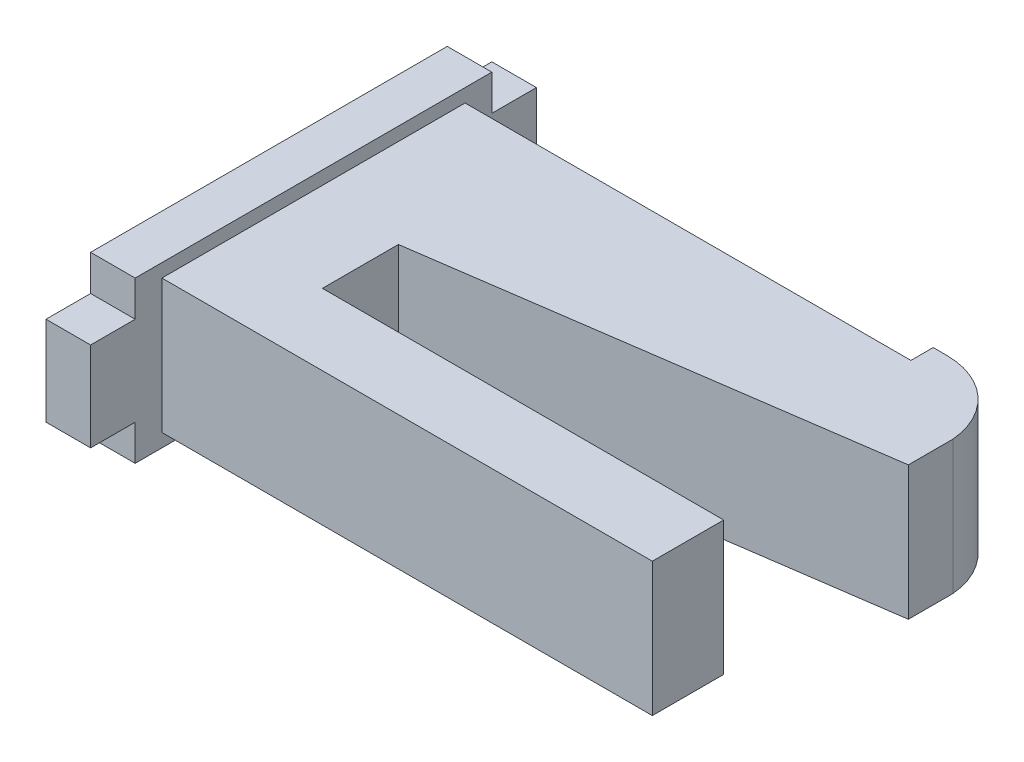
ISO-10303-21;
HEADER;
FILE_DESCRIPTION(('STEP AP214'),'2;1');
FILE_NAME('part.step','',(''),(''),'','','');
FILE_SCHEMA(('AUTOMOTIVE_DESIGN { 1 0 10303 214 1 1 1 1 }'));
ENDSEC;
DATA;
#1=APPLICATION_CONTEXT('core data for automotive mechanical design processes');
#2=APPLICATION_PROTOCOL_DEFINITION('international standard','automotive_design',2000,#1);
#3=PRODUCT_CONTEXT('',#1,'mechanical');
#4=PRODUCT('Part','Part','',(#3));
#5=PRODUCT_RELATED_PRODUCT_CATEGORY('part','',(#4));
#6=PRODUCT_DEFINITION_FORMATION('','',#4);
#7=PRODUCT_DEFINITION_CONTEXT('part definition',#1,'design');
#8=PRODUCT_DEFINITION('design','',#6,#7);
#9=PRODUCT_DEFINITION_SHAPE('','',#8);
#10=(LENGTH_UNIT() NAMED_UNIT(*) SI_UNIT(.MILLI.,.METRE.));
#11=(NAMED_UNIT(*) PLANE_ANGLE_UNIT() SI_UNIT($,.RADIAN.));
#12=(NAMED_UNIT(*) SI_UNIT($,.STERADIAN.) SOLID_ANGLE_UNIT());
#13=UNCERTAINTY_MEASURE_WITH_UNIT(LENGTH_MEASURE(1.E-05),#10,'distance_accuracy_value','');
#14=(GEOMETRIC_REPRESENTATION_CONTEXT(3) GLOBAL_UNCERTAINTY_ASSIGNED_CONTEXT((#13)) GLOBAL_UNIT_ASSIGNED_CONTEXT((#10,
#11,#12)) REPRESENTATION_CONTEXT('',''));
#15=CARTESIAN_POINT('',(0.,0.,0.));
#16=DIRECTION('',(0.,0.,1.));
#17=DIRECTION('',(1.,0.,0.));
#18=AXIS2_PLACEMENT_3D('',#15,#16,#17);
#19=CARTESIAN_POINT('',(0.,15.,-40.));
#20=DIRECTION('',(0.,0.,1.));
#21=DIRECTION('',(1.,0.,0.));
#22=AXIS2_PLACEMENT_3D('',#19,#20,#21);
#23=PLANE('',#22);
#24=DIRECTION('',(0.,-1.,0.));
#25=VECTOR('',#24,1.);
#26=CARTESIAN_POINT('',(0.,15.,-40.));
#27=LINE('',#26,#25);
#28=CARTESIAN_POINT('',(0.,2.5,-40.));
#29=VERTEX_POINT('',#28);
#30=CARTESIAN_POINT('',(0.,-1.5,-40.));
#31=VERTEX_POINT('',#30);
#32=EDGE_CURVE('E336',#29,#31,#27,.T.);
#33=ORIENTED_EDGE('',*,*,#32,.F.);
#34=DIRECTION('',(1.,0.,0.));
#35=VECTOR('',#34,1.);
#36=CARTESIAN_POINT('',(0.,2.5,-40.));
#37=LINE('',#36,#35);
#38=CARTESIAN_POINT('',(5.,2.5,-40.));
#39=VERTEX_POINT('',#38);
#40=EDGE_CURVE('E222',#29,#39,#37,.T.);
#41=ORIENTED_EDGE('',*,*,#40,.T.);
#42=DIRECTION('',(0.,-1.,0.));
#43=VECTOR('',#42,1.);
#44=CARTESIAN_POINT('',(5.,15.,-40.));
#45=LINE('',#44,#43);
#46=CARTESIAN_POINT('',(5.,-1.5,-40.));
#47=VERTEX_POINT('',#46);
#48=EDGE_CURVE('E201',#39,#47,#45,.T.);
#49=ORIENTED_EDGE('',*,*,#48,.T.);
#50=DIRECTION('',(1.,0.,0.));
#51=VECTOR('',#50,1.);
#52=CARTESIAN_POINT('',(5.,-1.5,-40.));
#53=LINE('',#52,#51);
#54=EDGE_CURVE('E279',#31,#47,#53,.T.);
#55=ORIENTED_EDGE('',*,*,#54,.F.);
#56=EDGE_LOOP('',(#33,#41,#49,#55));
#57=FACE_BOUND('',#56,.T.);
#58=ADVANCED_FACE('F39',(#57),#23,.F.);
#59=CARTESIAN_POINT('',(5.,15.,0.));
#60=DIRECTION('',(0.,0.,-1.));
#61=DIRECTION('',(-1.,0.,0.));
#62=AXIS2_PLACEMENT_3D('',#59,#60,#61);
#63=PLANE('',#62);
#64=DIRECTION('',(0.,-1.,0.));
#65=VECTOR('',#64,1.);
#66=CARTESIAN_POINT('',(5.,15.,0.));
#67=LINE('',#66,#65);
#68=CARTESIAN_POINT('',(5.,2.5,0.));
#69=VERTEX_POINT('',#68);
#70=CARTESIAN_POINT('',(5.,-1.5,0.));
#71=VERTEX_POINT('',#70);
#72=EDGE_CURVE('E370',#69,#71,#67,.T.);
#73=ORIENTED_EDGE('',*,*,#72,.F.);
#74=DIRECTION('',(-1.,0.,0.));
#75=VECTOR('',#74,1.);
#76=CARTESIAN_POINT('',(5.,2.5,0.));
#77=LINE('',#76,#75);
#78=CARTESIAN_POINT('',(0.,2.5,0.));
#79=VERTEX_POINT('',#78);
#80=EDGE_CURVE('E233',#69,#79,#77,.T.);
#81=ORIENTED_EDGE('',*,*,#80,.T.);
#82=DIRECTION('',(0.,-1.,0.));
#83=VECTOR('',#82,1.);
#84=CARTESIAN_POINT('',(0.,15.,0.));
#85=LINE('',#84,#83);
#86=CARTESIAN_POINT('',(0.,-1.5,0.));
#87=VERTEX_POINT('',#86);
#88=EDGE_CURVE('E316',#79,#87,#85,.T.);
#89=ORIENTED_EDGE('',*,*,#88,.T.);
#90=DIRECTION('',(-1.,0.,0.));
#91=VECTOR('',#90,1.);
#92=CARTESIAN_POINT('',(0.,-1.5,0.));
#93=LINE('',#92,#91);
#94=EDGE_CURVE('E281',#71,#87,#93,.T.);
#95=ORIENTED_EDGE('',*,*,#94,.F.);
#96=EDGE_LOOP('',(#73,#81,#89,#95));
#97=FACE_BOUND('',#96,.T.);
#98=ADVANCED_FACE('F399',(#97),#63,.F.);
#99=CARTESIAN_POINT('',(56.5,15.,-30.9674770892384));
#100=DIRECTION('',(0.,-1.,0.));
#101=DIRECTION('',(0.,0.,-1.));
#102=AXIS2_PLACEMENT_3D('',#99,#100,#101);
#103=PLANE('',#102);
#104=DIRECTION('',(0.,0.,-1.));
#105=VECTOR('',#104,1.);
#106=CARTESIAN_POINT('',(5.,15.,-40.));
#107=LINE('',#106,#105);
#108=CARTESIAN_POINT('',(5.,15.,-3.));
#109=VERTEX_POINT('',#108);
#110=CARTESIAN_POINT('',(5.,15.,-37.));
#111=VERTEX_POINT('',#110);
#112=EDGE_CURVE('E48',#109,#111,#107,.T.);
#113=ORIENTED_EDGE('',*,*,#112,.F.);
#114=DIRECTION('',(1.,0.,0.));
#115=VECTOR('',#114,1.);
#116=CARTESIAN_POINT('',(15.,15.,-3.));
#117=LINE('',#116,#115);
#118=CARTESIAN_POINT('',(60.,15.,-3.00000000000001));
#119=VERTEX_POINT('',#118);
#120=EDGE_CURVE('E305',#109,#119,#117,.T.);
#121=ORIENTED_EDGE('',*,*,#120,.T.);
#122=DIRECTION('',(0.,0.,-1.));
#123=VECTOR('',#122,1.);
#124=CARTESIAN_POINT('',(60.,15.,-3.00000000000001));
#125=LINE('',#124,#123);
#126=CARTESIAN_POINT('',(60.,15.,-11.));
#127=VERTEX_POINT('',#126);
#128=EDGE_CURVE('E264',#119,#127,#125,.T.);
#129=ORIENTED_EDGE('',*,*,#128,.T.);
#130=DIRECTION('',(-1.,0.,0.));
#131=VECTOR('',#130,1.);
#132=CARTESIAN_POINT('',(60.,15.,-11.));
#133=LINE('',#132,#131);
#134=CARTESIAN_POINT('',(15.,15.,-11.));
#135=VERTEX_POINT('',#134);
#136=EDGE_CURVE('E267',#127,#135,#133,.T.);
#137=ORIENTED_EDGE('',*,*,#136,.T.);
#138=DIRECTION('',(0.,0.,-1.));
#139=VECTOR('',#138,1.);
#140=CARTESIAN_POINT('',(15.,15.,-19.5182848298487));
#141=LINE('',#140,#139);
#142=CARTESIAN_POINT('',(15.,15.,-19.5182848298487));
#143=VERTEX_POINT('',#142);
#144=EDGE_CURVE('E302',#135,#143,#141,.T.);
#145=ORIENTED_EDGE('',*,*,#144,.T.);
#146=DIRECTION('',(0.989808738963641,0.,-0.142403161029544));
#147=VECTOR('',#146,1.);
#148=CARTESIAN_POINT('',(65.,15.,-26.7117533972531));
#149=LINE('',#148,#147);
#150=CARTESIAN_POINT('',(65.,15.,-26.7117533972531));
#151=VERTEX_POINT('',#150);
#152=EDGE_CURVE('E310',#143,#151,#149,.T.);
#153=ORIENTED_EDGE('',*,*,#152,.T.);
#154=DIRECTION('',(0.,0.,-1.));
#155=VECTOR('',#154,1.);
#156=CARTESIAN_POINT('',(65.,15.,-31.7117533972531));
#157=LINE('',#156,#155);
#158=CARTESIAN_POINT('',(65.,15.,-31.7117533972531));
#159=VERTEX_POINT('',#158);
#160=EDGE_CURVE('E307',#151,#159,#157,.T.);
#161=ORIENTED_EDGE('',*,*,#160,.T.);
#162=CARTESIAN_POINT('',(56.5,15.,-30.9674770892384));
#163=DIRECTION('',(0.,1.,0.));
#164=DIRECTION('',(0.,0.,-1.));
#165=AXIS2_PLACEMENT_3D('',#162,#163,#164);
#166=CIRCLE('',#165,8.53252291076164);
#167=CARTESIAN_POINT('',(56.5,15.,-39.5));
#168=VERTEX_POINT('',#167);
#169=EDGE_CURVE('E311',#159,#168,#166,.T.);
#170=ORIENTED_EDGE('',*,*,#169,.T.);
#171=DIRECTION('',(-1.,0.,0.));
#172=VECTOR('',#171,1.);
#173=CARTESIAN_POINT('',(55.,15.,-39.5));
#174=LINE('',#173,#172);
#175=CARTESIAN_POINT('',(55.,15.,-39.5));
#176=VERTEX_POINT('',#175);
#177=EDGE_CURVE('E312',#168,#176,#174,.T.);
#178=ORIENTED_EDGE('',*,*,#177,.T.);
#179=DIRECTION('',(0.,0.,1.));
#180=VECTOR('',#179,1.);
#181=CARTESIAN_POINT('',(55.,15.,-37.));
#182=LINE('',#181,#180);
#183=CARTESIAN_POINT('',(55.,15.,-37.));
#184=VERTEX_POINT('',#183);
#185=EDGE_CURVE('E314',#176,#184,#182,.T.);
#186=ORIENTED_EDGE('',*,*,#185,.T.);
#187=DIRECTION('',(-1.,0.,0.));
#188=VECTOR('',#187,1.);
#189=CARTESIAN_POINT('',(5.,15.,-37.));
#190=LINE('',#189,#188);
#191=EDGE_CURVE('E320',#184,#111,#190,.T.);
#192=ORIENTED_EDGE('',*,*,#191,.T.);
#193=EDGE_LOOP('',(#113,#121,#129,#137,#145,#153,#161,#170,#178,#186,#192));
#194=FACE_BOUND('',#193,.T.);
#195=ADVANCED_FACE('F409',(#194),#103,.F.);
#196=CARTESIAN_POINT('',(0.,16.5,0.));
#197=VERTEX_POINT('',#196);
#198=CARTESIAN_POINT('',(0.,12.5,0.));
#199=VERTEX_POINT('',#198);
#200=EDGE_CURVE('E334',#197,#199,#85,.T.);
#201=ORIENTED_EDGE('',*,*,#200,.T.);
#202=DIRECTION('',(1.,0.,0.));
#203=VECTOR('',#202,1.);
#204=CARTESIAN_POINT('',(0.,12.5,0.));
#205=LINE('',#204,#203);
#206=CARTESIAN_POINT('',(5.,12.5,0.));
#207=VERTEX_POINT('',#206);
#208=EDGE_CURVE('E238',#199,#207,#205,.T.);
#209=ORIENTED_EDGE('',*,*,#208,.T.);
#210=CARTESIAN_POINT('',(5.,16.5,0.));
#211=VERTEX_POINT('',#210);
#212=EDGE_CURVE('E43',#211,#207,#67,.T.);
#213=ORIENTED_EDGE('',*,*,#212,.F.);
#214=DIRECTION('',(1.,0.,0.));
#215=VECTOR('',#214,1.);
#216=CARTESIAN_POINT('',(5.,16.5,0.));
#217=LINE('',#216,#215);
#218=EDGE_CURVE('E291',#197,#211,#217,.T.);
#219=ORIENTED_EDGE('',*,*,#218,.F.);
#220=EDGE_LOOP('',(#201,#209,#213,#219));
#221=FACE_BOUND('',#220,.T.);
#222=ADVANCED_FACE('F41',(#221),#63,.F.);
#223=CARTESIAN_POINT('',(15.,15.,-3.));
#224=DIRECTION('',(0.,0.,-1.));
#225=DIRECTION('',(-1.,0.,0.));
#226=AXIS2_PLACEMENT_3D('',#223,#224,#225);
#227=PLANE('',#226);
#228=DIRECTION('',(1.,0.,0.));
#229=VECTOR('',#228,1.);
#230=CARTESIAN_POINT('',(15.,0.,-3.));
#231=LINE('',#230,#229);
#232=CARTESIAN_POINT('',(5.,0.,-3.));
#233=VERTEX_POINT('',#232);
#234=CARTESIAN_POINT('',(60.,0.,-3.00000000000001));
#235=VERTEX_POINT('',#234);
#236=EDGE_CURVE('E299',#233,#235,#231,.T.);
#237=ORIENTED_EDGE('',*,*,#236,.T.);
#238=DIRECTION('',(0.,1.,0.));
#239=VECTOR('',#238,1.);
#240=CARTESIAN_POINT('',(60.,0.,-3.00000000000001));
#241=LINE('',#240,#239);
#242=EDGE_CURVE('E258',#235,#119,#241,.T.);
#243=ORIENTED_EDGE('',*,*,#242,.T.);
#244=ORIENTED_EDGE('',*,*,#120,.F.);
#245=DIRECTION('',(0.,-1.,0.));
#246=VECTOR('',#245,1.);
#247=CARTESIAN_POINT('',(5.,15.,-3.));
#248=LINE('',#247,#246);
#249=EDGE_CURVE('E362',#109,#233,#248,.T.);
#250=ORIENTED_EDGE('',*,*,#249,.T.);
#251=EDGE_LOOP('',(#237,#243,#244,#250));
#252=FACE_BOUND('',#251,.T.);
#253=ADVANCED_FACE('F624',(#252),#227,.F.);
#254=CARTESIAN_POINT('',(15.,15.,-19.5182848298487));
#255=DIRECTION('',(-1.,0.,0.));
#256=DIRECTION('',(0.,0.,1.));
#257=AXIS2_PLACEMENT_3D('',#254,#255,#256);
#258=PLANE('',#257);
#259=ORIENTED_EDGE('',*,*,#144,.F.);
#260=DIRECTION('',(0.,-1.,0.));
#261=VECTOR('',#260,1.);
#262=CARTESIAN_POINT('',(15.,15.,-11.));
#263=LINE('',#262,#261);
#264=CARTESIAN_POINT('',(15.,0.,-11.));
#265=VERTEX_POINT('',#264);
#266=EDGE_CURVE('E255',#135,#265,#263,.T.);
#267=ORIENTED_EDGE('',*,*,#266,.T.);
#268=DIRECTION('',(0.,0.,-1.));
#269=VECTOR('',#268,1.);
#270=CARTESIAN_POINT('',(15.,0.,-19.5182848298487));
#271=LINE('',#270,#269);
#272=CARTESIAN_POINT('',(15.,0.,-19.5182848298487));
#273=VERTEX_POINT('',#272);
#274=EDGE_CURVE('E322',#265,#273,#271,.T.);
#275=ORIENTED_EDGE('',*,*,#274,.T.);
#276=DIRECTION('',(0.,-1.,0.));
#277=VECTOR('',#276,1.);
#278=CARTESIAN_POINT('',(15.,15.,-19.5182848298487));
#279=LINE('',#278,#277);
#280=EDGE_CURVE('E361',#143,#273,#279,.T.);
#281=ORIENTED_EDGE('',*,*,#280,.F.);
#282=EDGE_LOOP('',(#259,#267,#275,#281));
#283=FACE_BOUND('',#282,.T.);
#284=ADVANCED_FACE('F614',(#283),#258,.F.);
#285=CARTESIAN_POINT('',(65.,15.,-26.7117533972531));
#286=DIRECTION('',(-0.142403161029544,0.,-0.989808738963641));
#287=DIRECTION('',(-0.989808738963641,0.,0.142403161029544));
#288=AXIS2_PLACEMENT_3D('',#285,#286,#287);
#289=PLANE('',#288);
#290=DIRECTION('',(0.989808738963641,0.,-0.142403161029544));
#291=VECTOR('',#290,1.);
#292=CARTESIAN_POINT('',(65.,0.,-26.7117533972531));
#293=LINE('',#292,#291);
#294=CARTESIAN_POINT('',(65.,0.,-26.7117533972531));
#295=VERTEX_POINT('',#294);
#296=EDGE_CURVE('E324',#273,#295,#293,.T.);
#297=ORIENTED_EDGE('',*,*,#296,.T.);
#298=DIRECTION('',(0.,-1.,0.));
#299=VECTOR('',#298,1.);
#300=CARTESIAN_POINT('',(65.,15.,-26.7117533972531));
#301=LINE('',#300,#299);
#302=EDGE_CURVE('E359',#151,#295,#301,.T.);
#303=ORIENTED_EDGE('',*,*,#302,.F.);
#304=ORIENTED_EDGE('',*,*,#152,.F.);
#305=ORIENTED_EDGE('',*,*,#280,.T.);
#306=EDGE_LOOP('',(#297,#303,#304,#305));
#307=FACE_BOUND('',#306,.T.);
#308=ADVANCED_FACE('F607',(#307),#289,.F.);
#309=CARTESIAN_POINT('',(65.,15.,-31.7117533972531));
#310=DIRECTION('',(-1.,0.,0.));
#311=DIRECTION('',(0.,0.,1.));
#312=AXIS2_PLACEMENT_3D('',#309,#310,#311);
#313=PLANE('',#312);
#314=DIRECTION('',(0.,0.,-1.));
#315=VECTOR('',#314,1.);
#316=CARTESIAN_POINT('',(65.,0.,-31.7117533972531));
#317=LINE('',#316,#315);
#318=CARTESIAN_POINT('',(65.,0.,-31.7117533972531));
#319=VERTEX_POINT('',#318);
#320=EDGE_CURVE('E323',#295,#319,#317,.T.);
#321=ORIENTED_EDGE('',*,*,#320,.T.);
#322=DIRECTION('',(0.,-1.,0.));
#323=VECTOR('',#322,1.);
#324=CARTESIAN_POINT('',(65.,15.,-31.7117533972531));
#325=LINE('',#324,#323);
#326=EDGE_CURVE('E357',#159,#319,#325,.T.);
#327=ORIENTED_EDGE('',*,*,#326,.F.);
#328=ORIENTED_EDGE('',*,*,#160,.F.);
#329=ORIENTED_EDGE('',*,*,#302,.T.);
#330=EDGE_LOOP('',(#321,#327,#328,#329));
#331=FACE_BOUND('',#330,.T.);
#332=ADVANCED_FACE('F600',(#331),#313,.F.);
#333=CARTESIAN_POINT('',(56.5,15.,-30.9674770892384));
#334=DIRECTION('',(0.,-1.,0.));
#335=DIRECTION('',(0.,0.,-1.));
#336=AXIS2_PLACEMENT_3D('',#333,#334,#335);
#337=CYLINDRICAL_SURFACE('',#336,8.53252291076164);
#338=CARTESIAN_POINT('',(56.5,0.,-30.9674770892384));
#339=DIRECTION('',(0.,1.,0.));
#340=DIRECTION('',(0.,0.,-1.));
#341=AXIS2_PLACEMENT_3D('',#338,#339,#340);
#342=CIRCLE('',#341,8.53252291076164);
#343=CARTESIAN_POINT('',(56.5,0.,-39.5));
#344=VERTEX_POINT('',#343);
#345=EDGE_CURVE('E330',#319,#344,#342,.T.);
#346=ORIENTED_EDGE('',*,*,#345,.T.);
#347=DIRECTION('',(0.,-1.,0.));
#348=VECTOR('',#347,1.);
#349=CARTESIAN_POINT('',(56.5,15.,-39.5));
#350=LINE('',#349,#348);
#351=EDGE_CURVE('E352',#168,#344,#350,.T.);
#352=ORIENTED_EDGE('',*,*,#351,.F.);
#353=ORIENTED_EDGE('',*,*,#169,.F.);
#354=ORIENTED_EDGE('',*,*,#326,.T.);
#355=EDGE_LOOP('',(#346,#352,#353,#354));
#356=FACE_BOUND('',#355,.T.);
#357=ADVANCED_FACE('F589',(#356),#337,.T.);
#358=CARTESIAN_POINT('',(55.,15.,-39.5));
#359=DIRECTION('',(0.,0.,1.));
#360=DIRECTION('',(1.,0.,0.));
#361=AXIS2_PLACEMENT_3D('',#358,#359,#360);
#362=PLANE('',#361);
#363=DIRECTION('',(-1.,0.,0.));
#364=VECTOR('',#363,1.);
#365=CARTESIAN_POINT('',(55.,0.,-39.5));
#366=LINE('',#365,#364);
#367=CARTESIAN_POINT('',(55.,0.,-39.5));
#368=VERTEX_POINT('',#367);
#369=EDGE_CURVE('E326',#344,#368,#366,.T.);
#370=ORIENTED_EDGE('',*,*,#369,.T.);
#371=DIRECTION('',(0.,-1.,0.));
#372=VECTOR('',#371,1.);
#373=CARTESIAN_POINT('',(55.,15.,-39.5));
#374=LINE('',#373,#372);
#375=EDGE_CURVE('E353',#176,#368,#374,.T.);
#376=ORIENTED_EDGE('',*,*,#375,.F.);
#377=ORIENTED_EDGE('',*,*,#177,.F.);
#378=ORIENTED_EDGE('',*,*,#351,.T.);
#379=EDGE_LOOP('',(#370,#376,#377,#378));
#380=FACE_BOUND('',#379,.T.);
#381=ADVANCED_FACE('F576',(#380),#362,.F.);
#382=CARTESIAN_POINT('',(55.,15.,-37.));
#383=DIRECTION('',(1.,0.,0.));
#384=DIRECTION('',(0.,0.,-1.));
#385=AXIS2_PLACEMENT_3D('',#382,#383,#384);
#386=PLANE('',#385);
#387=DIRECTION('',(0.,0.,1.));
#388=VECTOR('',#387,1.);
#389=CARTESIAN_POINT('',(55.,0.,-37.));
#390=LINE('',#389,#388);
#391=CARTESIAN_POINT('',(55.,0.,-37.));
#392=VERTEX_POINT('',#391);
#393=EDGE_CURVE('E333',#368,#392,#390,.T.);
#394=ORIENTED_EDGE('',*,*,#393,.T.);
#395=DIRECTION('',(0.,-1.,0.));
#396=VECTOR('',#395,1.);
#397=CARTESIAN_POINT('',(55.,15.,-37.));
#398=LINE('',#397,#396);
#399=EDGE_CURVE('E349',#184,#392,#398,.T.);
#400=ORIENTED_EDGE('',*,*,#399,.F.);
#401=ORIENTED_EDGE('',*,*,#185,.F.);
#402=ORIENTED_EDGE('',*,*,#375,.T.);
#403=EDGE_LOOP('',(#394,#400,#401,#402));
#404=FACE_BOUND('',#403,.T.);
#405=ADVANCED_FACE('F569',(#404),#386,.F.);
#406=CARTESIAN_POINT('',(5.,15.,-37.));
#407=DIRECTION('',(0.,0.,1.));
#408=DIRECTION('',(1.,0.,0.));
#409=AXIS2_PLACEMENT_3D('',#406,#407,#408);
#410=PLANE('',#409);
#411=DIRECTION('',(-1.,0.,0.));
#412=VECTOR('',#411,1.);
#413=CARTESIAN_POINT('',(5.,0.,-37.));
#414=LINE('',#413,#412);
#415=CARTESIAN_POINT('',(5.,0.,-37.));
#416=VERTEX_POINT('',#415);
#417=EDGE_CURVE('E304',#392,#416,#414,.T.);
#418=ORIENTED_EDGE('',*,*,#417,.T.);
#419=DIRECTION('',(0.,-1.,0.));
#420=VECTOR('',#419,1.);
#421=CARTESIAN_POINT('',(5.,15.,-37.));
#422=LINE('',#421,#420);
#423=EDGE_CURVE('E343',#111,#416,#422,.T.);
#424=ORIENTED_EDGE('',*,*,#423,.F.);
#425=ORIENTED_EDGE('',*,*,#191,.F.);
#426=ORIENTED_EDGE('',*,*,#399,.T.);
#427=EDGE_LOOP('',(#418,#424,#425,#426));
#428=FACE_BOUND('',#427,.T.);
#429=ADVANCED_FACE('F417',(#428),#410,.F.);
#430=CARTESIAN_POINT('',(5.,15.,-40.));
#431=DIRECTION('',(-1.,0.,0.));
#432=DIRECTION('',(0.,0.,1.));
#433=AXIS2_PLACEMENT_3D('',#430,#431,#432);
#434=PLANE('',#433);
#435=DIRECTION('',(0.,0.,1.));
#436=VECTOR('',#435,1.);
#437=CARTESIAN_POINT('',(5.,-1.5,0.));
#438=LINE('',#437,#436);
#439=EDGE_CURVE('E282',#47,#71,#438,.T.);
#440=ORIENTED_EDGE('',*,*,#439,.F.);
#441=ORIENTED_EDGE('',*,*,#48,.F.);
#442=DIRECTION('',(0.,0.,1.));
#443=VECTOR('',#442,1.);
#444=CARTESIAN_POINT('',(5.,2.5,-45.));
#445=LINE('',#444,#443);
#446=CARTESIAN_POINT('',(5.,2.5,-45.));
#447=VERTEX_POINT('',#446);
#448=EDGE_CURVE('E200',#447,#39,#445,.T.);
#449=ORIENTED_EDGE('',*,*,#448,.F.);
#450=DIRECTION('',(0.,1.,0.));
#451=VECTOR('',#450,1.);
#452=CARTESIAN_POINT('',(5.,2.5,-45.));
#453=LINE('',#452,#451);
#454=CARTESIAN_POINT('',(5.,12.5,-45.));
#455=VERTEX_POINT('',#454);
#456=EDGE_CURVE('E205',#447,#455,#453,.T.);
#457=ORIENTED_EDGE('',*,*,#456,.T.);
#458=DIRECTION('',(0.,0.,1.));
#459=VECTOR('',#458,1.);
#460=CARTESIAN_POINT('',(5.,12.5,-45.));
#461=LINE('',#460,#459);
#462=CARTESIAN_POINT('',(5.,12.5,-40.));
#463=VERTEX_POINT('',#462);
#464=EDGE_CURVE('E206',#455,#463,#461,.T.);
#465=ORIENTED_EDGE('',*,*,#464,.T.);
#466=CARTESIAN_POINT('',(5.,16.5,-40.));
#467=VERTEX_POINT('',#466);
#468=EDGE_CURVE('E345',#467,#463,#45,.T.);
#469=ORIENTED_EDGE('',*,*,#468,.F.);
#470=DIRECTION('',(0.,0.,-1.));
#471=VECTOR('',#470,1.);
#472=CARTESIAN_POINT('',(5.,16.5,-40.));
#473=LINE('',#472,#471);
#474=EDGE_CURVE('E298',#211,#467,#473,.T.);
#475=ORIENTED_EDGE('',*,*,#474,.F.);
#476=ORIENTED_EDGE('',*,*,#212,.T.);
#477=DIRECTION('',(0.,0.,-1.));
#478=VECTOR('',#477,1.);
#479=CARTESIAN_POINT('',(5.,12.5,5.));
#480=LINE('',#479,#478);
#481=CARTESIAN_POINT('',(5.,12.5,5.));
#482=VERTEX_POINT('',#481);
#483=EDGE_CURVE('E61',#482,#207,#480,.T.);
#484=ORIENTED_EDGE('',*,*,#483,.F.);
#485=DIRECTION('',(0.,-1.,0.));
#486=VECTOR('',#485,1.);
#487=CARTESIAN_POINT('',(5.,12.5,5.));
#488=LINE('',#487,#486);
#489=CARTESIAN_POINT('',(5.,2.5,5.));
#490=VERTEX_POINT('',#489);
#491=EDGE_CURVE('E243',#482,#490,#488,.T.);
#492=ORIENTED_EDGE('',*,*,#491,.T.);
#493=DIRECTION('',(0.,0.,-1.));
#494=VECTOR('',#493,1.);
#495=CARTESIAN_POINT('',(5.,2.5,5.));
#496=LINE('',#495,#494);
#497=EDGE_CURVE('E249',#490,#69,#496,.T.);
#498=ORIENTED_EDGE('',*,*,#497,.T.);
#499=ORIENTED_EDGE('',*,*,#72,.T.);
#500=EDGE_LOOP('',(#440,#441,#449,#457,#465,#469,#475,#476,#484,#492,#498,#499));
#501=FACE_BOUND('',#500,.T.);
#502=ORIENTED_EDGE('',*,*,#423,.T.);
#503=DIRECTION('',(0.,0.,1.));
#504=VECTOR('',#503,1.);
#505=CARTESIAN_POINT('',(5.,0.,0.));
#506=LINE('',#505,#504);
#507=EDGE_CURVE('E11',#416,#233,#506,.T.);
#508=ORIENTED_EDGE('',*,*,#507,.T.);
#509=ORIENTED_EDGE('',*,*,#249,.F.);
#510=ORIENTED_EDGE('',*,*,#112,.T.);
#511=EDGE_LOOP('',(#502,#508,#509,#510));
#512=FACE_BOUND('',#511,.T.);
#513=ADVANCED_FACE('F198',(#501,#512),#434,.F.);
#514=ORIENTED_EDGE('',*,*,#468,.T.);
#515=DIRECTION('',(-1.,0.,0.));
#516=VECTOR('',#515,1.);
#517=CARTESIAN_POINT('',(5.,12.5,-40.));
#518=LINE('',#517,#516);
#519=CARTESIAN_POINT('',(0.,12.5,-40.));
#520=VERTEX_POINT('',#519);
#521=EDGE_CURVE('E225',#463,#520,#518,.T.);
#522=ORIENTED_EDGE('',*,*,#521,.T.);
#523=CARTESIAN_POINT('',(0.,16.5,-40.));
#524=VERTEX_POINT('',#523);
#525=EDGE_CURVE('E339',#524,#520,#27,.T.);
#526=ORIENTED_EDGE('',*,*,#525,.F.);
#527=DIRECTION('',(-1.,0.,0.));
#528=VECTOR('',#527,1.);
#529=CARTESIAN_POINT('',(0.,16.5,-40.));
#530=LINE('',#529,#528);
#531=EDGE_CURVE('E288',#467,#524,#530,.T.);
#532=ORIENTED_EDGE('',*,*,#531,.F.);
#533=EDGE_LOOP('',(#514,#522,#526,#532));
#534=FACE_BOUND('',#533,.T.);
#535=ADVANCED_FACE('F401',(#534),#23,.F.);
#536=CARTESIAN_POINT('',(0.,15.,0.));
#537=DIRECTION('',(1.,0.,0.));
#538=DIRECTION('',(0.,0.,-1.));
#539=AXIS2_PLACEMENT_3D('',#536,#537,#538);
#540=PLANE('',#539);
#541=ORIENTED_EDGE('',*,*,#525,.T.);
#542=DIRECTION('',(0.,0.,1.));
#543=VECTOR('',#542,1.);
#544=CARTESIAN_POINT('',(0.,12.5,-45.));
#545=LINE('',#544,#543);
#546=CARTESIAN_POINT('',(0.,12.5,-45.));
#547=VERTEX_POINT('',#546);
#548=EDGE_CURVE('E57',#547,#520,#545,.T.);
#549=ORIENTED_EDGE('',*,*,#548,.F.);
#550=DIRECTION('',(0.,-1.,0.));
#551=VECTOR('',#550,1.);
#552=CARTESIAN_POINT('',(0.,12.5,-45.));
#553=LINE('',#552,#551);
#554=CARTESIAN_POINT('',(0.,2.5,-45.));
#555=VERTEX_POINT('',#554);
#556=EDGE_CURVE('E209',#547,#555,#553,.T.);
#557=ORIENTED_EDGE('',*,*,#556,.T.);
#558=DIRECTION('',(0.,0.,1.));
#559=VECTOR('',#558,1.);
#560=CARTESIAN_POINT('',(0.,2.5,-45.));
#561=LINE('',#560,#559);
#562=EDGE_CURVE('E223',#555,#29,#561,.T.);
#563=ORIENTED_EDGE('',*,*,#562,.T.);
#564=ORIENTED_EDGE('',*,*,#32,.T.);
#565=DIRECTION('',(0.,0.,-1.));
#566=VECTOR('',#565,1.);
#567=CARTESIAN_POINT('',(0.,-1.5,-40.));
#568=LINE('',#567,#566);
#569=EDGE_CURVE('E274',#87,#31,#568,.T.);
#570=ORIENTED_EDGE('',*,*,#569,.F.);
#571=ORIENTED_EDGE('',*,*,#88,.F.);
#572=DIRECTION('',(0.,0.,-1.));
#573=VECTOR('',#572,1.);
#574=CARTESIAN_POINT('',(0.,2.5,5.));
#575=LINE('',#574,#573);
#576=CARTESIAN_POINT('',(0.,2.5,5.));
#577=VERTEX_POINT('',#576);
#578=EDGE_CURVE('E246',#577,#79,#575,.T.);
#579=ORIENTED_EDGE('',*,*,#578,.F.);
#580=DIRECTION('',(0.,1.,0.));
#581=VECTOR('',#580,1.);
#582=CARTESIAN_POINT('',(0.,2.5,5.));
#583=LINE('',#582,#581);
#584=CARTESIAN_POINT('',(0.,12.5,5.));
#585=VERTEX_POINT('',#584);
#586=EDGE_CURVE('E240',#577,#585,#583,.T.);
#587=ORIENTED_EDGE('',*,*,#586,.T.);
#588=DIRECTION('',(0.,0.,-1.));
#589=VECTOR('',#588,1.);
#590=CARTESIAN_POINT('',(0.,12.5,5.));
#591=LINE('',#590,#589);
#592=EDGE_CURVE('E251',#585,#199,#591,.T.);
#593=ORIENTED_EDGE('',*,*,#592,.T.);
#594=ORIENTED_EDGE('',*,*,#200,.F.);
#595=DIRECTION('',(0.,0.,1.));
#596=VECTOR('',#595,1.);
#597=CARTESIAN_POINT('',(0.,16.5,0.));
#598=LINE('',#597,#596);
#599=EDGE_CURVE('E289',#524,#197,#598,.T.);
#600=ORIENTED_EDGE('',*,*,#599,.F.);
#601=EDGE_LOOP('',(#541,#549,#557,#563,#564,#570,#571,#579,#587,#593,#594,#600));
#602=FACE_BOUND('',#601,.T.);
#603=ADVANCED_FACE('F385',(#602),#540,.F.);
#604=CARTESIAN_POINT('',(56.5,0.,-30.9674770892384));
#605=DIRECTION('',(0.,-1.,0.));
#606=DIRECTION('',(0.,0.,-1.));
#607=AXIS2_PLACEMENT_3D('',#604,#605,#606);
#608=PLANE('',#607);
#609=ORIENTED_EDGE('',*,*,#507,.F.);
#610=ORIENTED_EDGE('',*,*,#417,.F.);
#611=ORIENTED_EDGE('',*,*,#393,.F.);
#612=ORIENTED_EDGE('',*,*,#369,.F.);
#613=ORIENTED_EDGE('',*,*,#345,.F.);
#614=ORIENTED_EDGE('',*,*,#320,.F.);
#615=ORIENTED_EDGE('',*,*,#296,.F.);
#616=ORIENTED_EDGE('',*,*,#274,.F.);
#617=DIRECTION('',(-1.,0.,0.));
#618=VECTOR('',#617,1.);
#619=CARTESIAN_POINT('',(60.,0.,-11.));
#620=LINE('',#619,#618);
#621=CARTESIAN_POINT('',(60.,0.,-11.));
#622=VERTEX_POINT('',#621);
#623=EDGE_CURVE('E275',#622,#265,#620,.T.);
#624=ORIENTED_EDGE('',*,*,#623,.F.);
#625=DIRECTION('',(0.,0.,1.));
#626=VECTOR('',#625,1.);
#627=CARTESIAN_POINT('',(60.,0.,-11.));
#628=LINE('',#627,#626);
#629=EDGE_CURVE('E260',#622,#235,#628,.T.);
#630=ORIENTED_EDGE('',*,*,#629,.T.);
#631=ORIENTED_EDGE('',*,*,#236,.F.);
#632=EDGE_LOOP('',(#609,#610,#611,#612,#613,#614,#615,#616,#624,#630,#631));
#633=FACE_BOUND('',#632,.T.);
#634=ADVANCED_FACE('F416',(#633),#608,.T.);
#635=CARTESIAN_POINT('',(0.,16.5,0.));
#636=DIRECTION('',(0.,-1.,0.));
#637=DIRECTION('',(0.,0.,-1.));
#638=AXIS2_PLACEMENT_3D('',#635,#636,#637);
#639=PLANE('',#638);
#640=ORIENTED_EDGE('',*,*,#531,.T.);
#641=ORIENTED_EDGE('',*,*,#599,.T.);
#642=ORIENTED_EDGE('',*,*,#218,.T.);
#643=ORIENTED_EDGE('',*,*,#474,.T.);
#644=EDGE_LOOP('',(#640,#641,#642,#643));
#645=FACE_BOUND('',#644,.T.);
#646=ADVANCED_FACE('F377',(#645),#639,.F.);
#647=CARTESIAN_POINT('',(0.,-1.5,0.));
#648=DIRECTION('',(0.,1.,0.));
#649=DIRECTION('',(0.,0.,1.));
#650=AXIS2_PLACEMENT_3D('',#647,#648,#649);
#651=PLANE('',#650);
#652=ORIENTED_EDGE('',*,*,#569,.T.);
#653=ORIENTED_EDGE('',*,*,#54,.T.);
#654=ORIENTED_EDGE('',*,*,#439,.T.);
#655=ORIENTED_EDGE('',*,*,#94,.T.);
#656=EDGE_LOOP('',(#652,#653,#654,#655));
#657=FACE_BOUND('',#656,.T.);
#658=ADVANCED_FACE('F506',(#657),#651,.F.);
#659=CARTESIAN_POINT('',(60.,15.,-11.));
#660=DIRECTION('',(0.,0.,-1.));
#661=DIRECTION('',(0.,1.,0.));
#662=AXIS2_PLACEMENT_3D('',#659,#660,#661);
#663=PLANE('',#662);
#664=ORIENTED_EDGE('',*,*,#266,.F.);
#665=ORIENTED_EDGE('',*,*,#136,.F.);
#666=DIRECTION('',(0.,-1.,0.));
#667=VECTOR('',#666,1.);
#668=CARTESIAN_POINT('',(60.,15.,-11.));
#669=LINE('',#668,#667);
#670=EDGE_CURVE('E268',#127,#622,#669,.T.);
#671=ORIENTED_EDGE('',*,*,#670,.T.);
#672=ORIENTED_EDGE('',*,*,#623,.T.);
#673=EDGE_LOOP('',(#664,#665,#671,#672));
#674=FACE_BOUND('',#673,.T.);
#675=ADVANCED_FACE('F496',(#674),#663,.T.);
#676=CARTESIAN_POINT('',(60.,0.,0.));
#677=DIRECTION('',(-1.,0.,0.));
#678=DIRECTION('',(0.,0.,1.));
#679=AXIS2_PLACEMENT_3D('',#676,#677,#678);
#680=PLANE('',#679);
#681=ORIENTED_EDGE('',*,*,#629,.F.);
#682=ORIENTED_EDGE('',*,*,#670,.F.);
#683=ORIENTED_EDGE('',*,*,#128,.F.);
#684=ORIENTED_EDGE('',*,*,#242,.F.);
#685=EDGE_LOOP('',(#681,#682,#683,#684));
#686=FACE_BOUND('',#685,.T.);
#687=ADVANCED_FACE('F398',(#686),#680,.F.);
#688=CARTESIAN_POINT('',(5.,2.5,5.));
#689=DIRECTION('',(0.,-1.,0.));
#690=DIRECTION('',(0.,0.,-1.));
#691=AXIS2_PLACEMENT_3D('',#688,#689,#690);
#692=PLANE('',#691);
#693=ORIENTED_EDGE('',*,*,#80,.F.);
#694=ORIENTED_EDGE('',*,*,#497,.F.);
#695=DIRECTION('',(-1.,0.,0.));
#696=VECTOR('',#695,1.);
#697=CARTESIAN_POINT('',(5.,2.5,5.));
#698=LINE('',#697,#696);
#699=EDGE_CURVE('E234',#490,#577,#698,.T.);
#700=ORIENTED_EDGE('',*,*,#699,.T.);
#701=ORIENTED_EDGE('',*,*,#578,.T.);
#702=EDGE_LOOP('',(#693,#694,#700,#701));
#703=FACE_BOUND('',#702,.T.);
#704=ADVANCED_FACE('F389',(#703),#692,.T.);
#705=CARTESIAN_POINT('',(0.,12.5,5.));
#706=DIRECTION('',(0.,1.,0.));
#707=DIRECTION('',(0.,0.,1.));
#708=AXIS2_PLACEMENT_3D('',#705,#706,#707);
#709=PLANE('',#708);
#710=ORIENTED_EDGE('',*,*,#208,.F.);
#711=ORIENTED_EDGE('',*,*,#592,.F.);
#712=DIRECTION('',(1.,0.,0.));
#713=VECTOR('',#712,1.);
#714=CARTESIAN_POINT('',(0.,12.5,5.));
#715=LINE('',#714,#713);
#716=EDGE_CURVE('E241',#585,#482,#715,.T.);
#717=ORIENTED_EDGE('',*,*,#716,.T.);
#718=ORIENTED_EDGE('',*,*,#483,.T.);
#719=EDGE_LOOP('',(#710,#711,#717,#718));
#720=FACE_BOUND('',#719,.T.);
#721=ADVANCED_FACE('F383',(#720),#709,.T.);
#722=CARTESIAN_POINT('',(0.,0.,5.));
#723=DIRECTION('',(0.,0.,-1.));
#724=DIRECTION('',(-1.,0.,0.));
#725=AXIS2_PLACEMENT_3D('',#722,#723,#724);
#726=PLANE('',#725);
#727=ORIENTED_EDGE('',*,*,#699,.F.);
#728=ORIENTED_EDGE('',*,*,#491,.F.);
#729=ORIENTED_EDGE('',*,*,#716,.F.);
#730=ORIENTED_EDGE('',*,*,#586,.F.);
#731=EDGE_LOOP('',(#727,#728,#729,#730));
#732=FACE_BOUND('',#731,.T.);
#733=ADVANCED_FACE('F390',(#732),#726,.F.);
#734=CARTESIAN_POINT('',(0.,2.5,-45.));
#735=DIRECTION('',(0.,-1.,0.));
#736=DIRECTION('',(0.,0.,-1.));
#737=AXIS2_PLACEMENT_3D('',#734,#735,#736);
#738=PLANE('',#737);
#739=ORIENTED_EDGE('',*,*,#40,.F.);
#740=ORIENTED_EDGE('',*,*,#562,.F.);
#741=DIRECTION('',(1.,0.,0.));
#742=VECTOR('',#741,1.);
#743=CARTESIAN_POINT('',(0.,2.5,-45.));
#744=LINE('',#743,#742);
#745=EDGE_CURVE('E217',#555,#447,#744,.T.);
#746=ORIENTED_EDGE('',*,*,#745,.T.);
#747=ORIENTED_EDGE('',*,*,#448,.T.);
#748=EDGE_LOOP('',(#739,#740,#746,#747));
#749=FACE_BOUND('',#748,.T.);
#750=ADVANCED_FACE('F218',(#749),#738,.T.);
#751=CARTESIAN_POINT('',(5.,12.5,-45.));
#752=DIRECTION('',(0.,1.,0.));
#753=DIRECTION('',(0.,0.,1.));
#754=AXIS2_PLACEMENT_3D('',#751,#752,#753);
#755=PLANE('',#754);
#756=ORIENTED_EDGE('',*,*,#521,.F.);
#757=ORIENTED_EDGE('',*,*,#464,.F.);
#758=DIRECTION('',(-1.,0.,0.));
#759=VECTOR('',#758,1.);
#760=CARTESIAN_POINT('',(5.,12.5,-45.));
#761=LINE('',#760,#759);
#762=EDGE_CURVE('E219',#455,#547,#761,.T.);
#763=ORIENTED_EDGE('',*,*,#762,.T.);
#764=ORIENTED_EDGE('',*,*,#548,.T.);
#765=EDGE_LOOP('',(#756,#757,#763,#764));
#766=FACE_BOUND('',#765,.T.);
#767=ADVANCED_FACE('F419',(#766),#755,.T.);
#768=CARTESIAN_POINT('',(0.,0.,-45.));
#769=DIRECTION('',(0.,0.,1.));
#770=DIRECTION('',(1.,0.,0.));
#771=AXIS2_PLACEMENT_3D('',#768,#769,#770);
#772=PLANE('',#771);
#773=ORIENTED_EDGE('',*,*,#745,.F.);
#774=ORIENTED_EDGE('',*,*,#556,.F.);
#775=ORIENTED_EDGE('',*,*,#762,.F.);
#776=ORIENTED_EDGE('',*,*,#456,.F.);
#777=EDGE_LOOP('',(#773,#774,#775,#776));
#778=FACE_BOUND('',#777,.T.);
#779=ADVANCED_FACE('F211',(#778),#772,.F.);
#780=CLOSED_SHELL('',(#58,#98,#195,#222,#253,#284,#308,#332,#357,#381,#405,#429,#513,#535,#603,
#634,#646,#658,#675,#687,#704,#721,#733,#750,#767,#779));
#781=MANIFOLD_SOLID_BREP('B2',#780);
#782=ADVANCED_BREP_SHAPE_REPRESENTATION('',(#18,#781),#14);
#783=SHAPE_DEFINITION_REPRESENTATION(#9,#782);
ENDSEC;
END-ISO-10303-21;
